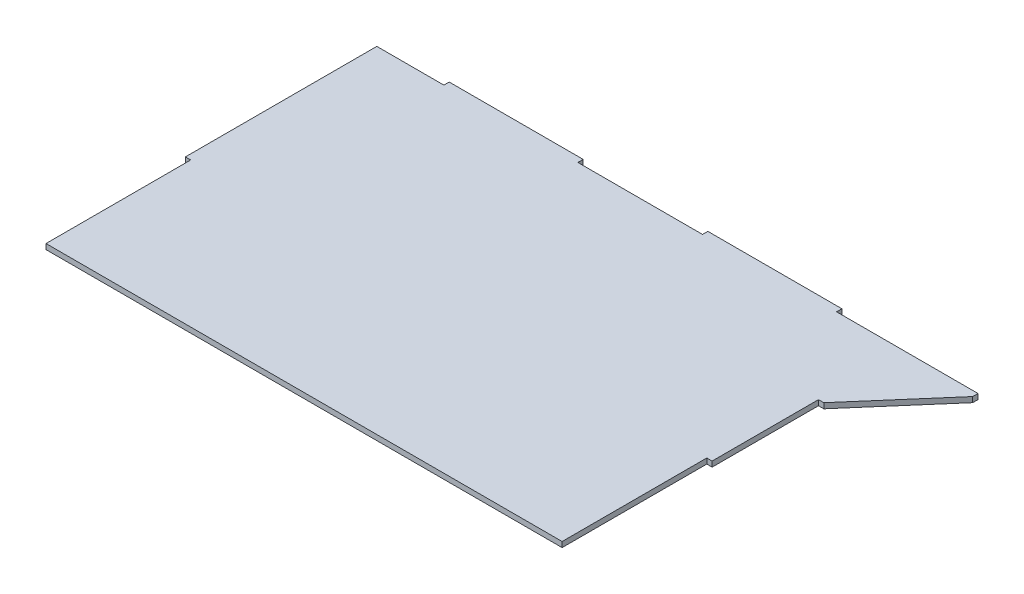
ISO-10303-21;
HEADER;
FILE_DESCRIPTION(('STEP AP214'),'2;1');
FILE_NAME('part.step','',(''),(''),'','','');
FILE_SCHEMA(('AUTOMOTIVE_DESIGN { 1 0 10303 214 1 1 1 1 }'));
ENDSEC;
DATA;
#1=APPLICATION_CONTEXT('core data for automotive mechanical design processes');
#2=APPLICATION_PROTOCOL_DEFINITION('international standard','automotive_design',2000,#1);
#3=PRODUCT_CONTEXT('',#1,'mechanical');
#4=PRODUCT('Part','Part','',(#3));
#5=PRODUCT_RELATED_PRODUCT_CATEGORY('part','',(#4));
#6=PRODUCT_DEFINITION_FORMATION('','',#4);
#7=PRODUCT_DEFINITION_CONTEXT('part definition',#1,'design');
#8=PRODUCT_DEFINITION('design','',#6,#7);
#9=PRODUCT_DEFINITION_SHAPE('','',#8);
#10=(LENGTH_UNIT() NAMED_UNIT(*) SI_UNIT(.MILLI.,.METRE.));
#11=(NAMED_UNIT(*) PLANE_ANGLE_UNIT() SI_UNIT($,.RADIAN.));
#12=(NAMED_UNIT(*) SI_UNIT($,.STERADIAN.) SOLID_ANGLE_UNIT());
#13=UNCERTAINTY_MEASURE_WITH_UNIT(LENGTH_MEASURE(1.E-05),#10,'distance_accuracy_value','');
#14=(GEOMETRIC_REPRESENTATION_CONTEXT(3) GLOBAL_UNCERTAINTY_ASSIGNED_CONTEXT((#13)) GLOBAL_UNIT_ASSIGNED_CONTEXT((#10,
#11,#12)) REPRESENTATION_CONTEXT('',''));
#15=CARTESIAN_POINT('',(0.,0.,0.));
#16=DIRECTION('',(0.,0.,1.));
#17=DIRECTION('',(1.,0.,0.));
#18=AXIS2_PLACEMENT_3D('',#15,#16,#17);
#19=CARTESIAN_POINT('',(157.2306,-1.5875,200.66180012));
#20=DIRECTION('',(-1.,0.,0.));
#21=DIRECTION('',(0.,0.,1.));
#22=AXIS2_PLACEMENT_3D('',#19,#20,#21);
#23=PLANE('',#22);
#24=DIRECTION('',(0.,-1.,0.));
#25=VECTOR('',#24,1.);
#26=CARTESIAN_POINT('',(157.2306,1.5875,50.8));
#27=LINE('',#26,#25);
#28=CARTESIAN_POINT('',(157.2306,1.5875,50.8000000000001));
#29=VERTEX_POINT('',#28);
#30=CARTESIAN_POINT('',(157.2306,-1.5875,50.8));
#31=VERTEX_POINT('',#30);
#32=EDGE_CURVE('E57',#29,#31,#27,.T.);
#33=ORIENTED_EDGE('',*,*,#32,.F.);
#34=DIRECTION('',(0.,0.,-1.));
#35=VECTOR('',#34,1.);
#36=CARTESIAN_POINT('',(157.2306,1.5875,200.66180012));
#37=LINE('',#36,#35);
#38=CARTESIAN_POINT('',(157.2306,1.5875,114.30180012));
#39=VERTEX_POINT('',#38);
#40=EDGE_CURVE('E318',#39,#29,#37,.T.);
#41=ORIENTED_EDGE('',*,*,#40,.F.);
#42=DIRECTION('',(0.,1.,0.));
#43=VECTOR('',#42,1.);
#44=CARTESIAN_POINT('',(157.2306,-1.5875,114.30180012));
#45=LINE('',#44,#43);
#46=CARTESIAN_POINT('',(157.2306,-1.5875,114.30180012));
#47=VERTEX_POINT('',#46);
#48=EDGE_CURVE('E11',#47,#39,#45,.T.);
#49=ORIENTED_EDGE('',*,*,#48,.F.);
#50=DIRECTION('',(0.,0.,-1.));
#51=VECTOR('',#50,1.);
#52=CARTESIAN_POINT('',(157.2306,-1.5875,200.66180012));
#53=LINE('',#52,#51);
#54=EDGE_CURVE('E304',#47,#31,#53,.T.);
#55=ORIENTED_EDGE('',*,*,#54,.T.);
#56=EDGE_LOOP('',(#33,#41,#49,#55));
#57=FACE_BOUND('',#56,.T.);
#58=ADVANCED_FACE('F43',(#57),#23,.F.);
#59=CARTESIAN_POINT('',(0.,0.,0.));
#60=DIRECTION('',(0.,0.,-1.));
#61=DIRECTION('',(-1.,0.,0.));
#62=AXIS2_PLACEMENT_3D('',#59,#60,#61);
#63=PLANE('',#62);
#64=DIRECTION('',(-1.,0.,0.));
#65=VECTOR('',#64,1.);
#66=CARTESIAN_POINT('',(-157.2306,1.5875,0.));
#67=LINE('',#66,#65);
#68=CARTESIAN_POINT('',(-117.1994,1.5875,0.));
#69=VERTEX_POINT('',#68);
#70=CARTESIAN_POINT('',(-157.2306,1.5875,0.));
#71=VERTEX_POINT('',#70);
#72=EDGE_CURVE('E65',#69,#71,#67,.T.);
#73=ORIENTED_EDGE('',*,*,#72,.F.);
#74=DIRECTION('',(0.,1.,0.));
#75=VECTOR('',#74,1.);
#76=CARTESIAN_POINT('',(-117.1994,0.,0.));
#77=LINE('',#76,#75);
#78=CARTESIAN_POINT('',(-117.1994,-1.5875,0.));
#79=VERTEX_POINT('',#78);
#80=EDGE_CURVE('E215',#79,#69,#77,.T.);
#81=ORIENTED_EDGE('',*,*,#80,.F.);
#82=DIRECTION('',(1.,0.,0.));
#83=VECTOR('',#82,1.);
#84=CARTESIAN_POINT('',(-157.2306,-1.5875,0.));
#85=LINE('',#84,#83);
#86=CARTESIAN_POINT('',(-157.2306,-1.5875,0.));
#87=VERTEX_POINT('',#86);
#88=EDGE_CURVE('E302',#87,#79,#85,.T.);
#89=ORIENTED_EDGE('',*,*,#88,.F.);
#90=DIRECTION('',(0.,-1.,0.));
#91=VECTOR('',#90,1.);
#92=CARTESIAN_POINT('',(-157.2306,-1.5875,0.));
#93=LINE('',#92,#91);
#94=EDGE_CURVE('E184',#71,#87,#93,.T.);
#95=ORIENTED_EDGE('',*,*,#94,.F.);
#96=EDGE_LOOP('',(#73,#81,#89,#95));
#97=FACE_BOUND('',#96,.T.);
#98=ADVANCED_FACE('F382',(#97),#63,.T.);
#99=CARTESIAN_POINT('',(117.2306,-1.5875,0.));
#100=VERTEX_POINT('',#99);
#101=CARTESIAN_POINT('',(201.66536,-1.5875,0.));
#102=VERTEX_POINT('',#101);
#103=EDGE_CURVE('E308',#100,#102,#85,.T.);
#104=ORIENTED_EDGE('',*,*,#103,.F.);
#105=DIRECTION('',(0.,1.,0.));
#106=VECTOR('',#105,1.);
#107=CARTESIAN_POINT('',(117.2306,0.,0.));
#108=LINE('',#107,#106);
#109=CARTESIAN_POINT('',(117.2306,1.5875,0.));
#110=VERTEX_POINT('',#109);
#111=EDGE_CURVE('E179',#100,#110,#108,.T.);
#112=ORIENTED_EDGE('',*,*,#111,.T.);
#113=CARTESIAN_POINT('',(201.66536,1.5875,0.));
#114=VERTEX_POINT('',#113);
#115=EDGE_CURVE('E173',#114,#110,#67,.T.);
#116=ORIENTED_EDGE('',*,*,#115,.F.);
#117=DIRECTION('',(0.,-1.,0.));
#118=VECTOR('',#117,1.);
#119=CARTESIAN_POINT('',(201.66536,1.5875,0.));
#120=LINE('',#119,#118);
#121=EDGE_CURVE('E176',#114,#102,#120,.T.);
#122=ORIENTED_EDGE('',*,*,#121,.T.);
#123=EDGE_LOOP('',(#104,#112,#116,#122));
#124=FACE_BOUND('',#123,.T.);
#125=ADVANCED_FACE('F175',(#124),#63,.T.);
#126=CARTESIAN_POINT('',(-157.2306,1.5875,200.66180012));
#127=DIRECTION('',(0.,-1.,0.));
#128=DIRECTION('',(0.,0.,-1.));
#129=AXIS2_PLACEMENT_3D('',#126,#127,#128);
#130=PLANE('',#129);
#131=DIRECTION('',(-1.,0.,0.));
#132=VECTOR('',#131,1.);
#133=CARTESIAN_POINT('',(-157.2306,1.5875,114.30180012));
#134=LINE('',#133,#132);
#135=CARTESIAN_POINT('',(154.0556,1.5875,114.30180012));
#136=VERTEX_POINT('',#135);
#137=EDGE_CURVE('E279',#39,#136,#134,.T.);
#138=ORIENTED_EDGE('',*,*,#137,.F.);
#139=ORIENTED_EDGE('',*,*,#40,.T.);
#140=DIRECTION('',(-1.,0.,0.));
#141=VECTOR('',#140,1.);
#142=CARTESIAN_POINT('',(157.2306,1.5875,50.8));
#143=LINE('',#142,#141);
#144=CARTESIAN_POINT('',(160.4056,1.5875,50.8));
#145=VERTEX_POINT('',#144);
#146=EDGE_CURVE('E194',#145,#29,#143,.T.);
#147=ORIENTED_EDGE('',*,*,#146,.F.);
#148=DIRECTION('',(-0.654792410139879,0.,0.755808771861778));
#149=VECTOR('',#148,1.);
#150=CARTESIAN_POINT('',(160.4056,1.5875,50.8));
#151=LINE('',#150,#149);
#152=CARTESIAN_POINT('',(201.66536,1.5875,3.175));
#153=VERTEX_POINT('',#152);
#154=EDGE_CURVE('E201',#153,#145,#151,.T.);
#155=ORIENTED_EDGE('',*,*,#154,.F.);
#156=DIRECTION('',(0.,0.,1.));
#157=VECTOR('',#156,1.);
#158=CARTESIAN_POINT('',(201.66536,1.5875,0.));
#159=LINE('',#158,#157);
#160=EDGE_CURVE('E190',#114,#153,#159,.T.);
#161=ORIENTED_EDGE('',*,*,#160,.F.);
#162=ORIENTED_EDGE('',*,*,#115,.T.);
#163=DIRECTION('',(0.,0.,1.));
#164=VECTOR('',#163,1.);
#165=CARTESIAN_POINT('',(117.2306,1.5875,-3.175));
#166=LINE('',#165,#164);
#167=CARTESIAN_POINT('',(117.2306,1.5875,-3.175));
#168=VERTEX_POINT('',#167);
#169=EDGE_CURVE('E261',#168,#110,#166,.T.);
#170=ORIENTED_EDGE('',*,*,#169,.F.);
#171=DIRECTION('',(1.,0.,0.));
#172=VECTOR('',#171,1.);
#173=CARTESIAN_POINT('',(0.,1.5875,-3.175));
#174=LINE('',#173,#172);
#175=CARTESIAN_POINT('',(37.2306,1.5875,-3.175));
#176=VERTEX_POINT('',#175);
#177=EDGE_CURVE('E250',#176,#168,#174,.T.);
#178=ORIENTED_EDGE('',*,*,#177,.F.);
#179=DIRECTION('',(0.,0.,1.));
#180=VECTOR('',#179,1.);
#181=CARTESIAN_POINT('',(37.2306,1.5875,-3.175));
#182=LINE('',#181,#180);
#183=CARTESIAN_POINT('',(37.2306,1.5875,0.));
#184=VERTEX_POINT('',#183);
#185=EDGE_CURVE('E263',#176,#184,#182,.T.);
#186=ORIENTED_EDGE('',*,*,#185,.T.);
#187=CARTESIAN_POINT('',(-37.1994,1.5875,0.));
#188=VERTEX_POINT('',#187);
#189=EDGE_CURVE('E185',#184,#188,#67,.T.);
#190=ORIENTED_EDGE('',*,*,#189,.T.);
#191=DIRECTION('',(0.,0.,1.));
#192=VECTOR('',#191,1.);
#193=CARTESIAN_POINT('',(-37.1994,1.5875,-3.175));
#194=LINE('',#193,#192);
#195=CARTESIAN_POINT('',(-37.1994,1.5875,-3.175));
#196=VERTEX_POINT('',#195);
#197=EDGE_CURVE('E235',#196,#188,#194,.T.);
#198=ORIENTED_EDGE('',*,*,#197,.F.);
#199=DIRECTION('',(1.,0.,0.));
#200=VECTOR('',#199,1.);
#201=CARTESIAN_POINT('',(-154.43,1.5875,-3.175));
#202=LINE('',#201,#200);
#203=CARTESIAN_POINT('',(-117.1994,1.5875,-3.175));
#204=VERTEX_POINT('',#203);
#205=EDGE_CURVE('E225',#204,#196,#202,.T.);
#206=ORIENTED_EDGE('',*,*,#205,.F.);
#207=DIRECTION('',(0.,0.,1.));
#208=VECTOR('',#207,1.);
#209=CARTESIAN_POINT('',(-117.1994,1.5875,-3.175));
#210=LINE('',#209,#208);
#211=EDGE_CURVE('E238',#204,#69,#210,.T.);
#212=ORIENTED_EDGE('',*,*,#211,.T.);
#213=ORIENTED_EDGE('',*,*,#72,.T.);
#214=DIRECTION('',(0.,0.,-1.));
#215=VECTOR('',#214,1.);
#216=CARTESIAN_POINT('',(-157.2306,1.5875,200.66180012));
#217=LINE('',#216,#215);
#218=CARTESIAN_POINT('',(-157.2306,1.5875,114.30180012));
#219=VERTEX_POINT('',#218);
#220=EDGE_CURVE('E315',#219,#71,#217,.T.);
#221=ORIENTED_EDGE('',*,*,#220,.F.);
#222=DIRECTION('',(1.,0.,0.));
#223=VECTOR('',#222,1.);
#224=CARTESIAN_POINT('',(-157.2306,1.5875,114.30180012));
#225=LINE('',#224,#223);
#226=CARTESIAN_POINT('',(-154.0556,1.5875,114.30180012));
#227=VERTEX_POINT('',#226);
#228=EDGE_CURVE('E296',#219,#227,#225,.T.);
#229=ORIENTED_EDGE('',*,*,#228,.T.);
#230=DIRECTION('',(0.,0.,-1.));
#231=VECTOR('',#230,1.);
#232=CARTESIAN_POINT('',(-154.0556,1.5875,200.66180012));
#233=LINE('',#232,#231);
#234=CARTESIAN_POINT('',(-154.0556,1.5875,200.66180012));
#235=VERTEX_POINT('',#234);
#236=EDGE_CURVE('E294',#235,#227,#233,.T.);
#237=ORIENTED_EDGE('',*,*,#236,.F.);
#238=DIRECTION('',(-1.,0.,0.));
#239=VECTOR('',#238,1.);
#240=CARTESIAN_POINT('',(-157.2306,1.5875,200.66180012));
#241=LINE('',#240,#239);
#242=CARTESIAN_POINT('',(154.0556,1.5875,200.66180012));
#243=VERTEX_POINT('',#242);
#244=EDGE_CURVE('E299',#243,#235,#241,.T.);
#245=ORIENTED_EDGE('',*,*,#244,.F.);
#246=DIRECTION('',(0.,0.,-1.));
#247=VECTOR('',#246,1.);
#248=CARTESIAN_POINT('',(154.0556,1.5875,200.66180012));
#249=LINE('',#248,#247);
#250=EDGE_CURVE('E281',#243,#136,#249,.T.);
#251=ORIENTED_EDGE('',*,*,#250,.T.);
#252=EDGE_LOOP('',(#138,#139,#147,#155,#161,#162,#170,#178,#186,#190,#198,#206,#212,#213,#221,
#229,#237,#245,#251));
#253=FACE_BOUND('',#252,.T.);
#254=ADVANCED_FACE('F198',(#253),#130,.F.);
#255=CARTESIAN_POINT('',(-157.2306,-1.5875,200.66180012));
#256=DIRECTION('',(0.,1.,0.));
#257=DIRECTION('',(0.,0.,1.));
#258=AXIS2_PLACEMENT_3D('',#255,#256,#257);
#259=PLANE('',#258);
#260=DIRECTION('',(-1.,0.,0.));
#261=VECTOR('',#260,1.);
#262=CARTESIAN_POINT('',(0.,-1.5875,114.30180012));
#263=LINE('',#262,#261);
#264=CARTESIAN_POINT('',(154.0556,-1.5875,114.30180012));
#265=VERTEX_POINT('',#264);
#266=EDGE_CURVE('E269',#47,#265,#263,.T.);
#267=ORIENTED_EDGE('',*,*,#266,.T.);
#268=DIRECTION('',(0.,0.,-1.));
#269=VECTOR('',#268,1.);
#270=CARTESIAN_POINT('',(154.0556,-1.5875,0.));
#271=LINE('',#270,#269);
#272=CARTESIAN_POINT('',(154.0556,-1.5875,200.66180012));
#273=VERTEX_POINT('',#272);
#274=EDGE_CURVE('E272',#273,#265,#271,.T.);
#275=ORIENTED_EDGE('',*,*,#274,.F.);
#276=DIRECTION('',(1.,0.,0.));
#277=VECTOR('',#276,1.);
#278=CARTESIAN_POINT('',(-157.2306,-1.5875,200.66180012));
#279=LINE('',#278,#277);
#280=CARTESIAN_POINT('',(-154.0556,-1.5875,200.66180012));
#281=VERTEX_POINT('',#280);
#282=EDGE_CURVE('E301',#281,#273,#279,.T.);
#283=ORIENTED_EDGE('',*,*,#282,.F.);
#284=DIRECTION('',(0.,0.,-1.));
#285=VECTOR('',#284,1.);
#286=CARTESIAN_POINT('',(-154.0556,-1.5875,0.));
#287=LINE('',#286,#285);
#288=CARTESIAN_POINT('',(-154.0556,-1.5875,114.30180012));
#289=VERTEX_POINT('',#288);
#290=EDGE_CURVE('E284',#281,#289,#287,.T.);
#291=ORIENTED_EDGE('',*,*,#290,.T.);
#292=DIRECTION('',(1.,0.,0.));
#293=VECTOR('',#292,1.);
#294=CARTESIAN_POINT('',(0.,-1.5875,114.30180012));
#295=LINE('',#294,#293);
#296=CARTESIAN_POINT('',(-157.2306,-1.5875,114.30180012));
#297=VERTEX_POINT('',#296);
#298=EDGE_CURVE('E287',#297,#289,#295,.T.);
#299=ORIENTED_EDGE('',*,*,#298,.F.);
#300=DIRECTION('',(0.,0.,-1.));
#301=VECTOR('',#300,1.);
#302=CARTESIAN_POINT('',(-157.2306,-1.5875,200.66180012));
#303=LINE('',#302,#301);
#304=EDGE_CURVE('E313',#297,#87,#303,.T.);
#305=ORIENTED_EDGE('',*,*,#304,.T.);
#306=ORIENTED_EDGE('',*,*,#88,.T.);
#307=DIRECTION('',(0.,0.,1.));
#308=VECTOR('',#307,1.);
#309=CARTESIAN_POINT('',(-117.1994,-1.5875,-3.175));
#310=LINE('',#309,#308);
#311=CARTESIAN_POINT('',(-117.1994,-1.5875,-3.175));
#312=VERTEX_POINT('',#311);
#313=EDGE_CURVE('E241',#312,#79,#310,.T.);
#314=ORIENTED_EDGE('',*,*,#313,.F.);
#315=DIRECTION('',(-1.,0.,0.));
#316=VECTOR('',#315,1.);
#317=CARTESIAN_POINT('',(-154.43,-1.5875,-3.175));
#318=LINE('',#317,#316);
#319=CARTESIAN_POINT('',(-37.1994,-1.5875,-3.175));
#320=VERTEX_POINT('',#319);
#321=EDGE_CURVE('E219',#320,#312,#318,.T.);
#322=ORIENTED_EDGE('',*,*,#321,.F.);
#323=DIRECTION('',(0.,0.,1.));
#324=VECTOR('',#323,1.);
#325=CARTESIAN_POINT('',(-37.1994,-1.5875,-3.175));
#326=LINE('',#325,#324);
#327=CARTESIAN_POINT('',(-37.1994,-1.5875,0.));
#328=VERTEX_POINT('',#327);
#329=EDGE_CURVE('E230',#320,#328,#326,.T.);
#330=ORIENTED_EDGE('',*,*,#329,.T.);
#331=CARTESIAN_POINT('',(37.2306,-1.5875,0.));
#332=VERTEX_POINT('',#331);
#333=EDGE_CURVE('E311',#328,#332,#85,.T.);
#334=ORIENTED_EDGE('',*,*,#333,.T.);
#335=DIRECTION('',(0.,0.,1.));
#336=VECTOR('',#335,1.);
#337=CARTESIAN_POINT('',(37.2306,-1.5875,-3.175));
#338=LINE('',#337,#336);
#339=CARTESIAN_POINT('',(37.2306,-1.5875,-3.175));
#340=VERTEX_POINT('',#339);
#341=EDGE_CURVE('E266',#340,#332,#338,.T.);
#342=ORIENTED_EDGE('',*,*,#341,.F.);
#343=DIRECTION('',(-1.,0.,0.));
#344=VECTOR('',#343,1.);
#345=CARTESIAN_POINT('',(0.,-1.5875,-3.175));
#346=LINE('',#345,#344);
#347=CARTESIAN_POINT('',(117.2306,-1.5875,-3.175));
#348=VERTEX_POINT('',#347);
#349=EDGE_CURVE('E245',#348,#340,#346,.T.);
#350=ORIENTED_EDGE('',*,*,#349,.F.);
#351=DIRECTION('',(0.,0.,1.));
#352=VECTOR('',#351,1.);
#353=CARTESIAN_POINT('',(117.2306,-1.5875,-3.175));
#354=LINE('',#353,#352);
#355=EDGE_CURVE('E255',#348,#100,#354,.T.);
#356=ORIENTED_EDGE('',*,*,#355,.T.);
#357=ORIENTED_EDGE('',*,*,#103,.T.);
#358=DIRECTION('',(0.,0.,1.));
#359=VECTOR('',#358,1.);
#360=CARTESIAN_POINT('',(201.66536,-1.5875,0.));
#361=LINE('',#360,#359);
#362=CARTESIAN_POINT('',(201.66536,-1.5875,3.175));
#363=VERTEX_POINT('',#362);
#364=EDGE_CURVE('E192',#102,#363,#361,.T.);
#365=ORIENTED_EDGE('',*,*,#364,.T.);
#366=DIRECTION('',(-0.654792410139879,0.,0.755808771861778));
#367=VECTOR('',#366,1.);
#368=CARTESIAN_POINT('',(160.4056,-1.5875,50.8));
#369=LINE('',#368,#367);
#370=CARTESIAN_POINT('',(160.4056,-1.5875,50.8));
#371=VERTEX_POINT('',#370);
#372=EDGE_CURVE('E206',#363,#371,#369,.T.);
#373=ORIENTED_EDGE('',*,*,#372,.T.);
#374=DIRECTION('',(-1.,0.,0.));
#375=VECTOR('',#374,1.);
#376=CARTESIAN_POINT('',(157.2306,-1.5875,50.8));
#377=LINE('',#376,#375);
#378=EDGE_CURVE('E202',#371,#31,#377,.T.);
#379=ORIENTED_EDGE('',*,*,#378,.T.);
#380=ORIENTED_EDGE('',*,*,#54,.F.);
#381=EDGE_LOOP('',(#267,#275,#283,#291,#299,#305,#306,#314,#322,#330,#334,#342,#350,#356,#357,
#365,#373,#379,#380));
#382=FACE_BOUND('',#381,.T.);
#383=ADVANCED_FACE('F338',(#382),#259,.F.);
#384=CARTESIAN_POINT('',(0.,0.,200.66180012));
#385=DIRECTION('',(0.,0.,-1.));
#386=DIRECTION('',(-1.,0.,0.));
#387=AXIS2_PLACEMENT_3D('',#384,#385,#386);
#388=PLANE('',#387);
#389=ORIENTED_EDGE('',*,*,#282,.T.);
#390=DIRECTION('',(0.,-1.,0.));
#391=VECTOR('',#390,1.);
#392=CARTESIAN_POINT('',(154.0556,1.587512,200.66180012));
#393=LINE('',#392,#391);
#394=EDGE_CURVE('E275',#243,#273,#393,.T.);
#395=ORIENTED_EDGE('',*,*,#394,.F.);
#396=ORIENTED_EDGE('',*,*,#244,.T.);
#397=DIRECTION('',(0.,1.,0.));
#398=VECTOR('',#397,1.);
#399=CARTESIAN_POINT('',(-154.0556,0.,200.66180012));
#400=LINE('',#399,#398);
#401=EDGE_CURVE('E50',#281,#235,#400,.T.);
#402=ORIENTED_EDGE('',*,*,#401,.F.);
#403=EDGE_LOOP('',(#389,#395,#396,#402));
#404=FACE_BOUND('',#403,.T.);
#405=ADVANCED_FACE('F342',(#404),#388,.F.);
#406=CARTESIAN_POINT('',(-157.2306,-1.5875,200.66180012));
#407=DIRECTION('',(1.,0.,0.));
#408=DIRECTION('',(0.,0.,-1.));
#409=AXIS2_PLACEMENT_3D('',#406,#407,#408);
#410=PLANE('',#409);
#411=ORIENTED_EDGE('',*,*,#304,.F.);
#412=DIRECTION('',(0.,-1.,0.));
#413=VECTOR('',#412,1.);
#414=CARTESIAN_POINT('',(-157.2306,1.587512,114.30180012));
#415=LINE('',#414,#413);
#416=EDGE_CURVE('E290',#219,#297,#415,.T.);
#417=ORIENTED_EDGE('',*,*,#416,.F.);
#418=ORIENTED_EDGE('',*,*,#220,.T.);
#419=ORIENTED_EDGE('',*,*,#94,.T.);
#420=EDGE_LOOP('',(#411,#417,#418,#419));
#421=FACE_BOUND('',#420,.T.);
#422=ADVANCED_FACE('F335',(#421),#410,.F.);
#423=DIRECTION('',(0.,1.,0.));
#424=VECTOR('',#423,1.);
#425=CARTESIAN_POINT('',(-37.1994,0.,0.));
#426=LINE('',#425,#424);
#427=EDGE_CURVE('E223',#328,#188,#426,.T.);
#428=ORIENTED_EDGE('',*,*,#427,.T.);
#429=ORIENTED_EDGE('',*,*,#189,.F.);
#430=DIRECTION('',(0.,1.,0.));
#431=VECTOR('',#430,1.);
#432=CARTESIAN_POINT('',(37.2306,0.,0.));
#433=LINE('',#432,#431);
#434=EDGE_CURVE('E244',#332,#184,#433,.T.);
#435=ORIENTED_EDGE('',*,*,#434,.F.);
#436=ORIENTED_EDGE('',*,*,#333,.F.);
#437=EDGE_LOOP('',(#428,#429,#435,#436));
#438=FACE_BOUND('',#437,.T.);
#439=ADVANCED_FACE('F361',(#438),#63,.T.);
#440=CARTESIAN_POINT('',(0.,1.587512,114.30180012));
#441=DIRECTION('',(0.,0.,-1.));
#442=DIRECTION('',(-1.,0.,0.));
#443=AXIS2_PLACEMENT_3D('',#440,#441,#442);
#444=PLANE('',#443);
#445=ORIENTED_EDGE('',*,*,#416,.T.);
#446=ORIENTED_EDGE('',*,*,#298,.T.);
#447=DIRECTION('',(0.,-1.,0.));
#448=VECTOR('',#447,1.);
#449=CARTESIAN_POINT('',(-154.0556,1.587512,114.30180012));
#450=LINE('',#449,#448);
#451=EDGE_CURVE('E292',#227,#289,#450,.T.);
#452=ORIENTED_EDGE('',*,*,#451,.F.);
#453=ORIENTED_EDGE('',*,*,#228,.F.);
#454=EDGE_LOOP('',(#445,#446,#452,#453));
#455=FACE_BOUND('',#454,.T.);
#456=ADVANCED_FACE('F331',(#455),#444,.F.);
#457=CARTESIAN_POINT('',(-154.0556,1.587512,0.));
#458=DIRECTION('',(-1.,0.,0.));
#459=DIRECTION('',(0.,0.,1.));
#460=AXIS2_PLACEMENT_3D('',#457,#458,#459);
#461=PLANE('',#460);
#462=ORIENTED_EDGE('',*,*,#236,.T.);
#463=ORIENTED_EDGE('',*,*,#451,.T.);
#464=ORIENTED_EDGE('',*,*,#290,.F.);
#465=ORIENTED_EDGE('',*,*,#401,.T.);
#466=EDGE_LOOP('',(#462,#463,#464,#465));
#467=FACE_BOUND('',#466,.T.);
#468=ADVANCED_FACE('F323',(#467),#461,.T.);
#469=CARTESIAN_POINT('',(154.0556,1.587512,0.));
#470=DIRECTION('',(-1.,0.,0.));
#471=DIRECTION('',(0.,0.,1.));
#472=AXIS2_PLACEMENT_3D('',#469,#470,#471);
#473=PLANE('',#472);
#474=ORIENTED_EDGE('',*,*,#394,.T.);
#475=ORIENTED_EDGE('',*,*,#274,.T.);
#476=DIRECTION('',(0.,-1.,0.));
#477=VECTOR('',#476,1.);
#478=CARTESIAN_POINT('',(154.0556,1.587512,114.30180012));
#479=LINE('',#478,#477);
#480=EDGE_CURVE('E277',#136,#265,#479,.T.);
#481=ORIENTED_EDGE('',*,*,#480,.F.);
#482=ORIENTED_EDGE('',*,*,#250,.F.);
#483=EDGE_LOOP('',(#474,#475,#481,#482));
#484=FACE_BOUND('',#483,.T.);
#485=ADVANCED_FACE('F344',(#484),#473,.F.);
#486=CARTESIAN_POINT('',(0.,1.587512,114.30180012));
#487=DIRECTION('',(0.,0.,1.));
#488=DIRECTION('',(1.,0.,0.));
#489=AXIS2_PLACEMENT_3D('',#486,#487,#488);
#490=PLANE('',#489);
#491=ORIENTED_EDGE('',*,*,#137,.T.);
#492=ORIENTED_EDGE('',*,*,#480,.T.);
#493=ORIENTED_EDGE('',*,*,#266,.F.);
#494=ORIENTED_EDGE('',*,*,#48,.T.);
#495=EDGE_LOOP('',(#491,#492,#493,#494));
#496=FACE_BOUND('',#495,.T.);
#497=ADVANCED_FACE('F489',(#496),#490,.T.);
#498=CARTESIAN_POINT('',(37.2306,0.,-3.175));
#499=DIRECTION('',(1.,0.,0.));
#500=DIRECTION('',(0.,0.,-1.));
#501=AXIS2_PLACEMENT_3D('',#498,#499,#500);
#502=PLANE('',#501);
#503=ORIENTED_EDGE('',*,*,#434,.T.);
#504=ORIENTED_EDGE('',*,*,#185,.F.);
#505=DIRECTION('',(0.,1.,0.));
#506=VECTOR('',#505,1.);
#507=CARTESIAN_POINT('',(37.2306,0.,-3.175));
#508=LINE('',#507,#506);
#509=EDGE_CURVE('E248',#340,#176,#508,.T.);
#510=ORIENTED_EDGE('',*,*,#509,.F.);
#511=ORIENTED_EDGE('',*,*,#341,.T.);
#512=EDGE_LOOP('',(#503,#504,#510,#511));
#513=FACE_BOUND('',#512,.T.);
#514=ADVANCED_FACE('F365',(#513),#502,.F.);
#515=CARTESIAN_POINT('',(117.2306,0.,-3.175));
#516=DIRECTION('',(1.,0.,0.));
#517=DIRECTION('',(0.,0.,-1.));
#518=AXIS2_PLACEMENT_3D('',#515,#516,#517);
#519=PLANE('',#518);
#520=ORIENTED_EDGE('',*,*,#111,.F.);
#521=ORIENTED_EDGE('',*,*,#355,.F.);
#522=DIRECTION('',(0.,1.,0.));
#523=VECTOR('',#522,1.);
#524=CARTESIAN_POINT('',(117.2306,0.,-3.175));
#525=LINE('',#524,#523);
#526=EDGE_CURVE('E252',#348,#168,#525,.T.);
#527=ORIENTED_EDGE('',*,*,#526,.T.);
#528=ORIENTED_EDGE('',*,*,#169,.T.);
#529=EDGE_LOOP('',(#520,#521,#527,#528));
#530=FACE_BOUND('',#529,.T.);
#531=ADVANCED_FACE('F371',(#530),#519,.T.);
#532=CARTESIAN_POINT('',(0.,0.,-3.175));
#533=DIRECTION('',(0.,0.,-1.));
#534=DIRECTION('',(-1.,0.,0.));
#535=AXIS2_PLACEMENT_3D('',#532,#533,#534);
#536=PLANE('',#535);
#537=ORIENTED_EDGE('',*,*,#349,.T.);
#538=ORIENTED_EDGE('',*,*,#509,.T.);
#539=ORIENTED_EDGE('',*,*,#177,.T.);
#540=ORIENTED_EDGE('',*,*,#526,.F.);
#541=EDGE_LOOP('',(#537,#538,#539,#540));
#542=FACE_BOUND('',#541,.T.);
#543=ADVANCED_FACE('F369',(#542),#536,.T.);
#544=CARTESIAN_POINT('',(-117.1994,0.,-3.175));
#545=DIRECTION('',(1.,0.,0.));
#546=DIRECTION('',(0.,0.,-1.));
#547=AXIS2_PLACEMENT_3D('',#544,#545,#546);
#548=PLANE('',#547);
#549=ORIENTED_EDGE('',*,*,#80,.T.);
#550=ORIENTED_EDGE('',*,*,#211,.F.);
#551=DIRECTION('',(0.,1.,0.));
#552=VECTOR('',#551,1.);
#553=CARTESIAN_POINT('',(-117.1994,0.,-3.175));
#554=LINE('',#553,#552);
#555=EDGE_CURVE('E222',#312,#204,#554,.T.);
#556=ORIENTED_EDGE('',*,*,#555,.F.);
#557=ORIENTED_EDGE('',*,*,#313,.T.);
#558=EDGE_LOOP('',(#549,#550,#556,#557));
#559=FACE_BOUND('',#558,.T.);
#560=ADVANCED_FACE('F381',(#559),#548,.F.);
#561=CARTESIAN_POINT('',(-37.1994,0.,-3.175));
#562=DIRECTION('',(1.,0.,0.));
#563=DIRECTION('',(0.,0.,-1.));
#564=AXIS2_PLACEMENT_3D('',#561,#562,#563);
#565=PLANE('',#564);
#566=ORIENTED_EDGE('',*,*,#427,.F.);
#567=ORIENTED_EDGE('',*,*,#329,.F.);
#568=DIRECTION('',(0.,1.,0.));
#569=VECTOR('',#568,1.);
#570=CARTESIAN_POINT('',(-37.1994,0.,-3.175));
#571=LINE('',#570,#569);
#572=EDGE_CURVE('E227',#320,#196,#571,.T.);
#573=ORIENTED_EDGE('',*,*,#572,.T.);
#574=ORIENTED_EDGE('',*,*,#197,.T.);
#575=EDGE_LOOP('',(#566,#567,#573,#574));
#576=FACE_BOUND('',#575,.T.);
#577=ADVANCED_FACE('F375',(#576),#565,.T.);
#578=CARTESIAN_POINT('',(-154.43,0.,-3.175));
#579=DIRECTION('',(0.,0.,-1.));
#580=DIRECTION('',(-1.,0.,0.));
#581=AXIS2_PLACEMENT_3D('',#578,#579,#580);
#582=PLANE('',#581);
#583=ORIENTED_EDGE('',*,*,#321,.T.);
#584=ORIENTED_EDGE('',*,*,#555,.T.);
#585=ORIENTED_EDGE('',*,*,#205,.T.);
#586=ORIENTED_EDGE('',*,*,#572,.F.);
#587=EDGE_LOOP('',(#583,#584,#585,#586));
#588=FACE_BOUND('',#587,.T.);
#589=ADVANCED_FACE('F378',(#588),#582,.T.);
#590=CARTESIAN_POINT('',(157.2306,1.5875,50.8));
#591=DIRECTION('',(0.,0.,1.));
#592=DIRECTION('',(1.,0.,0.));
#593=AXIS2_PLACEMENT_3D('',#590,#591,#592);
#594=PLANE('',#593);
#595=ORIENTED_EDGE('',*,*,#378,.F.);
#596=DIRECTION('',(0.,-1.,0.));
#597=VECTOR('',#596,1.);
#598=CARTESIAN_POINT('',(160.4056,1.5875,50.8));
#599=LINE('',#598,#597);
#600=EDGE_CURVE('E216',#145,#371,#599,.T.);
#601=ORIENTED_EDGE('',*,*,#600,.F.);
#602=ORIENTED_EDGE('',*,*,#146,.T.);
#603=ORIENTED_EDGE('',*,*,#32,.T.);
#604=EDGE_LOOP('',(#595,#601,#602,#603));
#605=FACE_BOUND('',#604,.T.);
#606=ADVANCED_FACE('F352',(#605),#594,.T.);
#607=CARTESIAN_POINT('',(160.4056,1.5875,50.8));
#608=DIRECTION('',(0.755808771861778,0.,0.654792410139878));
#609=DIRECTION('',(0.654792410139879,0.,-0.755808771861778));
#610=AXIS2_PLACEMENT_3D('',#607,#608,#609);
#611=PLANE('',#610);
#612=ORIENTED_EDGE('',*,*,#372,.F.);
#613=DIRECTION('',(0.,-1.,0.));
#614=VECTOR('',#613,1.);
#615=CARTESIAN_POINT('',(201.66536,1.5875,3.175));
#616=LINE('',#615,#614);
#617=EDGE_CURVE('E193',#153,#363,#616,.T.);
#618=ORIENTED_EDGE('',*,*,#617,.F.);
#619=ORIENTED_EDGE('',*,*,#154,.T.);
#620=ORIENTED_EDGE('',*,*,#600,.T.);
#621=EDGE_LOOP('',(#612,#618,#619,#620));
#622=FACE_BOUND('',#621,.T.);
#623=ADVANCED_FACE('F354',(#622),#611,.T.);
#624=CARTESIAN_POINT('',(201.66536,1.5875,0.));
#625=DIRECTION('',(1.,0.,0.));
#626=DIRECTION('',(0.,0.,-1.));
#627=AXIS2_PLACEMENT_3D('',#624,#625,#626);
#628=PLANE('',#627);
#629=ORIENTED_EDGE('',*,*,#364,.F.);
#630=ORIENTED_EDGE('',*,*,#121,.F.);
#631=ORIENTED_EDGE('',*,*,#160,.T.);
#632=ORIENTED_EDGE('',*,*,#617,.T.);
#633=EDGE_LOOP('',(#629,#630,#631,#632));
#634=FACE_BOUND('',#633,.T.);
#635=ADVANCED_FACE('F189',(#634),#628,.T.);
#636=CLOSED_SHELL('',(#58,#98,#125,#254,#383,#405,#422,#439,#456,#468,#485,#497,#514,#531,#543,
#560,#577,#589,#606,#623,#635));
#637=MANIFOLD_SOLID_BREP('B2',#636);
#638=ADVANCED_BREP_SHAPE_REPRESENTATION('',(#18,#637),#14);
#639=SHAPE_DEFINITION_REPRESENTATION(#9,#638);
ENDSEC;
END-ISO-10303-21;
